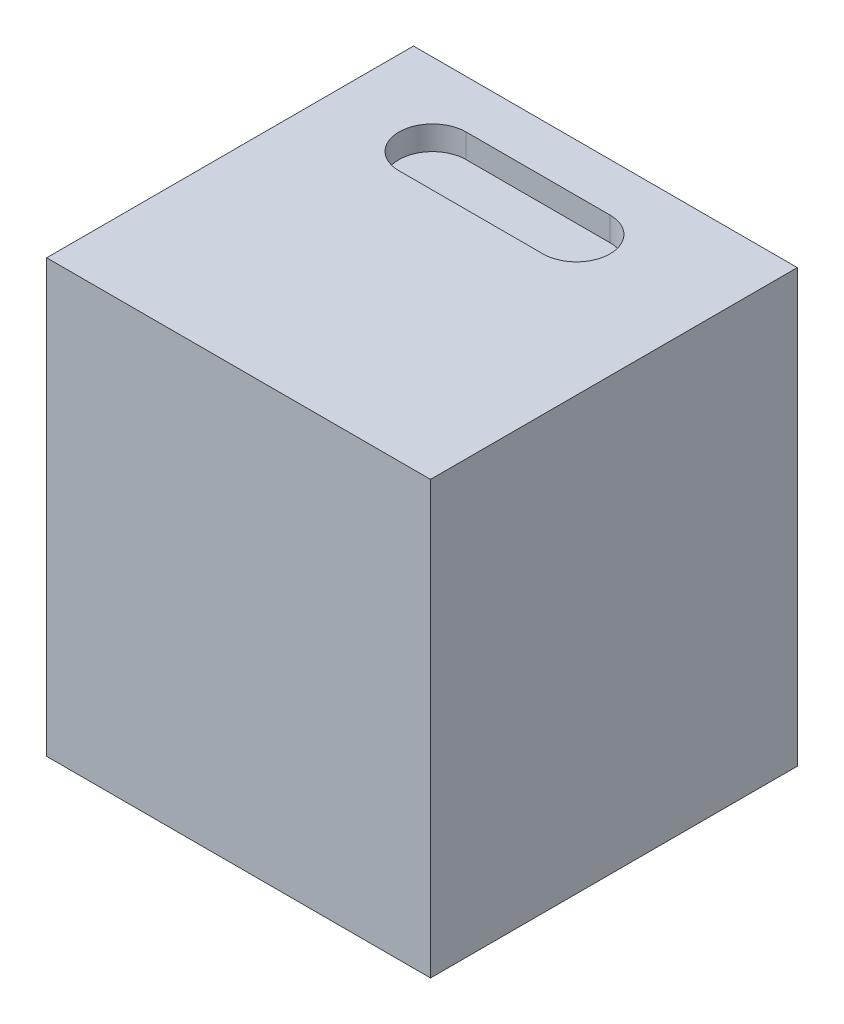
ISO-10303-21;
HEADER;
FILE_DESCRIPTION(('STEP AP214'),'2;1');
FILE_NAME('part.step','',(''),(''),'','','');
FILE_SCHEMA(('AUTOMOTIVE_DESIGN { 1 0 10303 214 1 1 1 1 }'));
ENDSEC;
DATA;
#1=APPLICATION_CONTEXT('core data for automotive mechanical design processes');
#2=APPLICATION_PROTOCOL_DEFINITION('international standard','automotive_design',2000,#1);
#3=PRODUCT_CONTEXT('',#1,'mechanical');
#4=PRODUCT('Part','Part','',(#3));
#5=PRODUCT_RELATED_PRODUCT_CATEGORY('part','',(#4));
#6=PRODUCT_DEFINITION_FORMATION('','',#4);
#7=PRODUCT_DEFINITION_CONTEXT('part definition',#1,'design');
#8=PRODUCT_DEFINITION('design','',#6,#7);
#9=PRODUCT_DEFINITION_SHAPE('','',#8);
#10=(LENGTH_UNIT() NAMED_UNIT(*) SI_UNIT(.MILLI.,.METRE.));
#11=(NAMED_UNIT(*) PLANE_ANGLE_UNIT() SI_UNIT($,.RADIAN.));
#12=(NAMED_UNIT(*) SI_UNIT($,.STERADIAN.) SOLID_ANGLE_UNIT());
#13=UNCERTAINTY_MEASURE_WITH_UNIT(LENGTH_MEASURE(1.E-05),#10,'distance_accuracy_value','');
#14=(GEOMETRIC_REPRESENTATION_CONTEXT(3) GLOBAL_UNCERTAINTY_ASSIGNED_CONTEXT((#13)) GLOBAL_UNIT_ASSIGNED_CONTEXT((#10,
#11,#12)) REPRESENTATION_CONTEXT('',''));
#15=CARTESIAN_POINT('',(0.,0.,0.));
#16=DIRECTION('',(0.,0.,1.));
#17=DIRECTION('',(1.,0.,0.));
#18=AXIS2_PLACEMENT_3D('',#15,#16,#17);
#19=CARTESIAN_POINT('',(-75.,20.,225.));
#20=DIRECTION('',(0.,-1.,0.));
#21=DIRECTION('',(0.,0.,-1.));
#22=AXIS2_PLACEMENT_3D('',#19,#20,#21);
#23=PLANE('',#22);
#24=CARTESIAN_POINT('',(-64.5,20.,183.));
#25=DIRECTION('',(0.,-1.,0.));
#26=DIRECTION('',(0.,0.,-1.));
#27=AXIS2_PLACEMENT_3D('',#24,#25,#26);
#28=CIRCLE('',#27,3.5);
#29=CARTESIAN_POINT('',(-64.5,20.,179.5));
#30=VERTEX_POINT('',#29);
#31=CARTESIAN_POINT('',(-64.5,20.,186.5));
#32=VERTEX_POINT('',#31);
#33=EDGE_CURVE('E321',#30,#32,#28,.F.);
#34=ORIENTED_EDGE('',*,*,#33,.F.);
#35=DIRECTION('',(-1.,0.,0.));
#36=VECTOR('',#35,1.);
#37=CARTESIAN_POINT('',(-74.9999999999999,20.,179.5));
#38=LINE('',#37,#36);
#39=CARTESIAN_POINT('',(-49.5,20.,179.5));
#40=VERTEX_POINT('',#39);
#41=EDGE_CURVE('E312',#40,#30,#38,.T.);
#42=ORIENTED_EDGE('',*,*,#41,.F.);
#43=CARTESIAN_POINT('',(-49.5,20.,183.));
#44=DIRECTION('',(0.,-1.,0.));
#45=DIRECTION('',(0.,0.,-1.));
#46=AXIS2_PLACEMENT_3D('',#43,#44,#45);
#47=CIRCLE('',#46,3.49999999999998);
#48=CARTESIAN_POINT('',(-49.5,20.,186.5));
#49=VERTEX_POINT('',#48);
#50=EDGE_CURVE('E315',#49,#40,#47,.F.);
#51=ORIENTED_EDGE('',*,*,#50,.F.);
#52=DIRECTION('',(1.,0.,0.));
#53=VECTOR('',#52,1.);
#54=CARTESIAN_POINT('',(-75.0000000000001,20.,186.5));
#55=LINE('',#54,#53);
#56=EDGE_CURVE('E318',#32,#49,#55,.T.);
#57=ORIENTED_EDGE('',*,*,#56,.F.);
#58=EDGE_LOOP('',(#34,#42,#51,#57));
#59=FACE_BOUND('',#58,.T.);
#60=DIRECTION('',(1.,0.,0.));
#61=VECTOR('',#60,1.);
#62=CARTESIAN_POINT('',(-75.,20.,174.484956087312));
#63=LINE('',#62,#61);
#64=CARTESIAN_POINT('',(-75.,20.,174.484956087312));
#65=VERTEX_POINT('',#64);
#66=CARTESIAN_POINT('',(-35.,20.,174.484956087312));
#67=VERTEX_POINT('',#66);
#68=EDGE_CURVE('E247',#65,#67,#63,.T.);
#69=ORIENTED_EDGE('',*,*,#68,.F.);
#70=DIRECTION('',(0.,0.,-1.));
#71=VECTOR('',#70,1.);
#72=CARTESIAN_POINT('',(-75.,20.,225.));
#73=LINE('',#72,#71);
#74=CARTESIAN_POINT('',(-75.,20.,212.710083215072));
#75=VERTEX_POINT('',#74);
#76=EDGE_CURVE('E324',#75,#65,#73,.T.);
#77=ORIENTED_EDGE('',*,*,#76,.F.);
#78=DIRECTION('',(-1.,0.,0.));
#79=VECTOR('',#78,1.);
#80=CARTESIAN_POINT('',(-75.,20.,212.710083215072));
#81=LINE('',#80,#79);
#82=CARTESIAN_POINT('',(-35.,20.,212.710083215072));
#83=VERTEX_POINT('',#82);
#84=EDGE_CURVE('E273',#83,#75,#81,.T.);
#85=ORIENTED_EDGE('',*,*,#84,.F.);
#86=DIRECTION('',(0.,0.,1.));
#87=VECTOR('',#86,1.);
#88=CARTESIAN_POINT('',(-35.,20.,225.));
#89=LINE('',#88,#87);
#90=EDGE_CURVE('E279',#67,#83,#89,.T.);
#91=ORIENTED_EDGE('',*,*,#90,.F.);
#92=EDGE_LOOP('',(#69,#77,#85,#91));
#93=FACE_BOUND('',#92,.T.);
#94=ADVANCED_FACE('F173',(#59,#93),#23,.F.);
#95=CARTESIAN_POINT('',(-75.,20.,225.));
#96=DIRECTION('',(1.,0.,0.));
#97=DIRECTION('',(0.,0.,-1.));
#98=AXIS2_PLACEMENT_3D('',#95,#96,#97);
#99=PLANE('',#98);
#100=CARTESIAN_POINT('',(-75.,-10.,195.));
#101=DIRECTION('',(-1.,0.,0.));
#102=DIRECTION('',(0.,0.,1.));
#103=AXIS2_PLACEMENT_3D('',#100,#101,#102);
#104=CIRCLE('',#103,11.);
#105=CARTESIAN_POINT('',(-75.,-10.,206.));
#106=VERTEX_POINT('',#105);
#107=EDGE_CURVE('E284',#106,#106,#104,.T.);
#108=ORIENTED_EDGE('',*,*,#107,.F.);
#109=EDGE_LOOP('',(#108));
#110=FACE_BOUND('',#109,.T.);
#111=DIRECTION('',(0.,1.,0.));
#112=VECTOR('',#111,1.);
#113=CARTESIAN_POINT('',(-75.,-25.,174.484956087312));
#114=LINE('',#113,#112);
#115=CARTESIAN_POINT('',(-75.,-25.,174.484956087312));
#116=VERTEX_POINT('',#115);
#117=EDGE_CURVE('E251',#116,#65,#114,.T.);
#118=ORIENTED_EDGE('',*,*,#117,.F.);
#119=DIRECTION('',(0.,0.,-1.));
#120=VECTOR('',#119,1.);
#121=CARTESIAN_POINT('',(-75.,-25.,225.));
#122=LINE('',#121,#120);
#123=CARTESIAN_POINT('',(-75.,-25.,212.710083215072));
#124=VERTEX_POINT('',#123);
#125=EDGE_CURVE('E265',#124,#116,#122,.T.);
#126=ORIENTED_EDGE('',*,*,#125,.F.);
#127=DIRECTION('',(0.,1.,0.));
#128=VECTOR('',#127,1.);
#129=CARTESIAN_POINT('',(-75.,-25.,212.710083215072));
#130=LINE('',#129,#128);
#131=EDGE_CURVE('E189',#124,#75,#130,.T.);
#132=ORIENTED_EDGE('',*,*,#131,.T.);
#133=ORIENTED_EDGE('',*,*,#76,.T.);
#134=EDGE_LOOP('',(#118,#126,#132,#133));
#135=FACE_BOUND('',#134,.T.);
#136=ADVANCED_FACE('F366',(#110,#135),#99,.F.);
#137=CARTESIAN_POINT('',(0.,-25.,0.));
#138=DIRECTION('',(0.,-1.,0.));
#139=DIRECTION('',(0.,0.,-1.));
#140=AXIS2_PLACEMENT_3D('',#137,#138,#139);
#141=PLANE('',#140);
#142=ORIENTED_EDGE('',*,*,#125,.T.);
#143=DIRECTION('',(-1.,0.,0.));
#144=VECTOR('',#143,1.);
#145=CARTESIAN_POINT('',(-75.,-25.,174.484956087312));
#146=LINE('',#145,#144);
#147=CARTESIAN_POINT('',(-35.,-25.,174.484956087312));
#148=VERTEX_POINT('',#147);
#149=EDGE_CURVE('E244',#148,#116,#146,.T.);
#150=ORIENTED_EDGE('',*,*,#149,.F.);
#151=DIRECTION('',(0.,0.,-1.));
#152=VECTOR('',#151,1.);
#153=CARTESIAN_POINT('',(-35.,-25.,174.484956087312));
#154=LINE('',#153,#152);
#155=CARTESIAN_POINT('',(-35.,-25.,212.710083215072));
#156=VERTEX_POINT('',#155);
#157=EDGE_CURVE('E255',#156,#148,#154,.T.);
#158=ORIENTED_EDGE('',*,*,#157,.F.);
#159=DIRECTION('',(1.,0.,0.));
#160=VECTOR('',#159,1.);
#161=CARTESIAN_POINT('',(-75.,-25.,212.710083215072));
#162=LINE('',#161,#160);
#163=EDGE_CURVE('E260',#124,#156,#162,.T.);
#164=ORIENTED_EDGE('',*,*,#163,.F.);
#165=EDGE_LOOP('',(#142,#150,#158,#164));
#166=FACE_BOUND('',#165,.T.);
#167=ADVANCED_FACE('F263',(#166),#141,.T.);
#168=CARTESIAN_POINT('',(-64.5,49.5,183.));
#169=DIRECTION('',(0.,-1.,0.));
#170=DIRECTION('',(0.,0.,-1.));
#171=AXIS2_PLACEMENT_3D('',#168,#169,#170);
#172=CYLINDRICAL_SURFACE('',#171,3.5);
#173=ORIENTED_EDGE('',*,*,#33,.T.);
#174=DIRECTION('',(0.,-1.,0.));
#175=VECTOR('',#174,1.);
#176=CARTESIAN_POINT('',(-64.5,49.5,186.5));
#177=LINE('',#176,#175);
#178=CARTESIAN_POINT('',(-64.5,17.5,186.5));
#179=VERTEX_POINT('',#178);
#180=EDGE_CURVE('E308',#32,#179,#177,.T.);
#181=ORIENTED_EDGE('',*,*,#180,.T.);
#182=CARTESIAN_POINT('',(-64.5,17.5,183.));
#183=DIRECTION('',(0.,1.,0.));
#184=DIRECTION('',(0.,0.,1.));
#185=AXIS2_PLACEMENT_3D('',#182,#183,#184);
#186=CIRCLE('',#185,3.5);
#187=CARTESIAN_POINT('',(-64.5,17.5,179.5));
#188=VERTEX_POINT('',#187);
#189=EDGE_CURVE('E12',#179,#188,#186,.F.);
#190=ORIENTED_EDGE('',*,*,#189,.T.);
#191=DIRECTION('',(0.,-1.,0.));
#192=VECTOR('',#191,1.);
#193=CARTESIAN_POINT('',(-64.5,49.5,179.5));
#194=LINE('',#193,#192);
#195=EDGE_CURVE('E298',#30,#188,#194,.T.);
#196=ORIENTED_EDGE('',*,*,#195,.F.);
#197=EDGE_LOOP('',(#173,#181,#190,#196));
#198=FACE_BOUND('',#197,.T.);
#199=ADVANCED_FACE('F345',(#198),#172,.F.);
#200=CARTESIAN_POINT('',(-64.5,49.5,186.5));
#201=DIRECTION('',(0.,0.,-1.));
#202=DIRECTION('',(-1.,0.,0.));
#203=AXIS2_PLACEMENT_3D('',#200,#201,#202);
#204=PLANE('',#203);
#205=ORIENTED_EDGE('',*,*,#56,.T.);
#206=DIRECTION('',(0.,-1.,0.));
#207=VECTOR('',#206,1.);
#208=CARTESIAN_POINT('',(-49.5,49.5,186.5));
#209=LINE('',#208,#207);
#210=CARTESIAN_POINT('',(-49.5,17.5,186.5));
#211=VERTEX_POINT('',#210);
#212=EDGE_CURVE('E304',#49,#211,#209,.T.);
#213=ORIENTED_EDGE('',*,*,#212,.T.);
#214=DIRECTION('',(-1.,0.,0.));
#215=VECTOR('',#214,1.);
#216=CARTESIAN_POINT('',(-70.,17.5,186.5));
#217=LINE('',#216,#215);
#218=EDGE_CURVE('E182',#211,#179,#217,.T.);
#219=ORIENTED_EDGE('',*,*,#218,.T.);
#220=ORIENTED_EDGE('',*,*,#180,.F.);
#221=EDGE_LOOP('',(#205,#213,#219,#220));
#222=FACE_BOUND('',#221,.T.);
#223=ADVANCED_FACE('F340',(#222),#204,.T.);
#224=CARTESIAN_POINT('',(-49.5,49.5,183.));
#225=DIRECTION('',(0.,-1.,0.));
#226=DIRECTION('',(0.,0.,-1.));
#227=AXIS2_PLACEMENT_3D('',#224,#225,#226);
#228=CYLINDRICAL_SURFACE('',#227,3.49999999999998);
#229=ORIENTED_EDGE('',*,*,#50,.T.);
#230=DIRECTION('',(0.,-1.,0.));
#231=VECTOR('',#230,1.);
#232=CARTESIAN_POINT('',(-49.5,49.5,179.5));
#233=LINE('',#232,#231);
#234=CARTESIAN_POINT('',(-49.5,17.5,179.5));
#235=VERTEX_POINT('',#234);
#236=EDGE_CURVE('E197',#40,#235,#233,.T.);
#237=ORIENTED_EDGE('',*,*,#236,.T.);
#238=CARTESIAN_POINT('',(-49.5,17.5,183.));
#239=DIRECTION('',(0.,1.,0.));
#240=DIRECTION('',(0.,0.,1.));
#241=AXIS2_PLACEMENT_3D('',#238,#239,#240);
#242=CIRCLE('',#241,3.49999999999998);
#243=EDGE_CURVE('E331',#235,#211,#242,.F.);
#244=ORIENTED_EDGE('',*,*,#243,.T.);
#245=ORIENTED_EDGE('',*,*,#212,.F.);
#246=EDGE_LOOP('',(#229,#237,#244,#245));
#247=FACE_BOUND('',#246,.T.);
#248=ADVANCED_FACE('F353',(#247),#228,.F.);
#249=CARTESIAN_POINT('',(-64.5,49.5,179.5));
#250=DIRECTION('',(0.,0.,1.));
#251=DIRECTION('',(1.,0.,0.));
#252=AXIS2_PLACEMENT_3D('',#249,#250,#251);
#253=PLANE('',#252);
#254=ORIENTED_EDGE('',*,*,#41,.T.);
#255=ORIENTED_EDGE('',*,*,#195,.T.);
#256=DIRECTION('',(1.,0.,0.));
#257=VECTOR('',#256,1.);
#258=CARTESIAN_POINT('',(-70.,17.5,179.5));
#259=LINE('',#258,#257);
#260=EDGE_CURVE('E328',#188,#235,#259,.T.);
#261=ORIENTED_EDGE('',*,*,#260,.T.);
#262=ORIENTED_EDGE('',*,*,#236,.F.);
#263=EDGE_LOOP('',(#254,#255,#261,#262));
#264=FACE_BOUND('',#263,.T.);
#265=ADVANCED_FACE('F355',(#264),#253,.T.);
#266=CARTESIAN_POINT('',(70.,17.5,225.));
#267=DIRECTION('',(0.,-1.,0.));
#268=DIRECTION('',(0.,0.,-1.));
#269=AXIS2_PLACEMENT_3D('',#266,#267,#268);
#270=PLANE('',#269);
#271=ORIENTED_EDGE('',*,*,#189,.F.);
#272=ORIENTED_EDGE('',*,*,#218,.F.);
#273=ORIENTED_EDGE('',*,*,#243,.F.);
#274=ORIENTED_EDGE('',*,*,#260,.F.);
#275=EDGE_LOOP('',(#271,#272,#273,#274));
#276=FACE_BOUND('',#275,.T.);
#277=ADVANCED_FACE('F354',(#276),#270,.F.);
#278=CARTESIAN_POINT('',(-68.,-10.,195.));
#279=DIRECTION('',(-1.,0.,0.));
#280=DIRECTION('',(0.,0.,1.));
#281=AXIS2_PLACEMENT_3D('',#278,#279,#280);
#282=PLANE('',#281);
#283=CARTESIAN_POINT('',(-68.,-10.,195.));
#284=DIRECTION('',(-1.,0.,0.));
#285=DIRECTION('',(0.,0.,1.));
#286=AXIS2_PLACEMENT_3D('',#283,#284,#285);
#287=CIRCLE('',#286,11.);
#288=CARTESIAN_POINT('',(-68.,-10.,206.));
#289=VERTEX_POINT('',#288);
#290=EDGE_CURVE('E285',#289,#289,#287,.T.);
#291=ORIENTED_EDGE('',*,*,#290,.T.);
#292=EDGE_LOOP('',(#291));
#293=FACE_BOUND('',#292,.T.);
#294=CARTESIAN_POINT('',(-68.,-10.,195.));
#295=DIRECTION('',(-1.,0.,0.));
#296=DIRECTION('',(0.,0.,1.));
#297=AXIS2_PLACEMENT_3D('',#294,#295,#296);
#298=CIRCLE('',#297,4.09999999999999);
#299=CARTESIAN_POINT('',(-68.,-10.,199.1));
#300=VERTEX_POINT('',#299);
#301=EDGE_CURVE('E176',#300,#300,#298,.F.);
#302=ORIENTED_EDGE('',*,*,#301,.T.);
#303=EDGE_LOOP('',(#302));
#304=FACE_BOUND('',#303,.T.);
#305=ADVANCED_FACE('F362',(#293,#304),#282,.T.);
#306=CARTESIAN_POINT('',(-68.,-10.,195.));
#307=DIRECTION('',(-1.,0.,0.));
#308=DIRECTION('',(0.,0.,1.));
#309=AXIS2_PLACEMENT_3D('',#306,#307,#308);
#310=CYLINDRICAL_SURFACE('',#309,11.);
#311=ORIENTED_EDGE('',*,*,#290,.F.);
#312=EDGE_LOOP('',(#311));
#313=FACE_BOUND('',#312,.T.);
#314=ORIENTED_EDGE('',*,*,#107,.T.);
#315=EDGE_LOOP('',(#314));
#316=FACE_BOUND('',#315,.T.);
#317=ADVANCED_FACE('F413',(#313,#316),#310,.F.);
#318=CARTESIAN_POINT('',(-53.,-10.,195.));
#319=DIRECTION('',(-1.,0.,0.));
#320=DIRECTION('',(0.,0.,1.));
#321=AXIS2_PLACEMENT_3D('',#318,#319,#320);
#322=PLANE('',#321);
#323=CARTESIAN_POINT('',(-53.,-10.,195.));
#324=DIRECTION('',(-1.,0.,0.));
#325=DIRECTION('',(0.,0.,1.));
#326=AXIS2_PLACEMENT_3D('',#323,#324,#325);
#327=CIRCLE('',#326,4.09999999999999);
#328=CARTESIAN_POINT('',(-53.,-10.,199.1));
#329=VERTEX_POINT('',#328);
#330=EDGE_CURVE('E292',#329,#329,#327,.T.);
#331=ORIENTED_EDGE('',*,*,#330,.T.);
#332=EDGE_LOOP('',(#331));
#333=FACE_BOUND('',#332,.T.);
#334=ADVANCED_FACE('F408',(#333),#322,.T.);
#335=CARTESIAN_POINT('',(-53.,-10.,195.));
#336=DIRECTION('',(-1.,0.,0.));
#337=DIRECTION('',(0.,0.,1.));
#338=AXIS2_PLACEMENT_3D('',#335,#336,#337);
#339=CYLINDRICAL_SURFACE('',#338,4.09999999999999);
#340=ORIENTED_EDGE('',*,*,#330,.F.);
#341=EDGE_LOOP('',(#340));
#342=FACE_BOUND('',#341,.T.);
#343=ORIENTED_EDGE('',*,*,#301,.F.);
#344=EDGE_LOOP('',(#343));
#345=FACE_BOUND('',#344,.T.);
#346=ADVANCED_FACE('F412',(#342,#345),#339,.F.);
#347=CARTESIAN_POINT('',(-75.,-25.,174.484956087312));
#348=DIRECTION('',(0.,0.,-1.));
#349=DIRECTION('',(-1.,0.,0.));
#350=AXIS2_PLACEMENT_3D('',#347,#348,#349);
#351=PLANE('',#350);
#352=ORIENTED_EDGE('',*,*,#68,.T.);
#353=DIRECTION('',(0.,1.,0.));
#354=VECTOR('',#353,1.);
#355=CARTESIAN_POINT('',(-35.,-25.,174.484956087312));
#356=LINE('',#355,#354);
#357=EDGE_CURVE('E240',#148,#67,#356,.T.);
#358=ORIENTED_EDGE('',*,*,#357,.F.);
#359=ORIENTED_EDGE('',*,*,#149,.T.);
#360=ORIENTED_EDGE('',*,*,#117,.T.);
#361=EDGE_LOOP('',(#352,#358,#359,#360));
#362=FACE_BOUND('',#361,.T.);
#363=ADVANCED_FACE('F242',(#362),#351,.T.);
#364=CARTESIAN_POINT('',(-35.,-25.,174.484956087312));
#365=DIRECTION('',(1.,0.,0.));
#366=DIRECTION('',(0.,0.,-1.));
#367=AXIS2_PLACEMENT_3D('',#364,#365,#366);
#368=PLANE('',#367);
#369=ORIENTED_EDGE('',*,*,#90,.T.);
#370=DIRECTION('',(0.,1.,0.));
#371=VECTOR('',#370,1.);
#372=CARTESIAN_POINT('',(-35.,-25.,212.710083215072));
#373=LINE('',#372,#371);
#374=EDGE_CURVE('E252',#156,#83,#373,.T.);
#375=ORIENTED_EDGE('',*,*,#374,.F.);
#376=ORIENTED_EDGE('',*,*,#157,.T.);
#377=ORIENTED_EDGE('',*,*,#357,.T.);
#378=EDGE_LOOP('',(#369,#375,#376,#377));
#379=FACE_BOUND('',#378,.T.);
#380=ADVANCED_FACE('F256',(#379),#368,.T.);
#381=CARTESIAN_POINT('',(-75.,-25.,212.710083215072));
#382=DIRECTION('',(0.,0.,1.));
#383=DIRECTION('',(1.,0.,0.));
#384=AXIS2_PLACEMENT_3D('',#381,#382,#383);
#385=PLANE('',#384);
#386=ORIENTED_EDGE('',*,*,#84,.T.);
#387=ORIENTED_EDGE('',*,*,#131,.F.);
#388=ORIENTED_EDGE('',*,*,#163,.T.);
#389=ORIENTED_EDGE('',*,*,#374,.T.);
#390=EDGE_LOOP('',(#386,#387,#388,#389));
#391=FACE_BOUND('',#390,.T.);
#392=ADVANCED_FACE('F481',(#391),#385,.T.);
#393=CLOSED_SHELL('',(#94,#136,#167,#199,#223,#248,#265,#277,#305,#317,#334,#346,#363,#380,#392));
#394=MANIFOLD_SOLID_BREP('B2',#393);
#395=ADVANCED_BREP_SHAPE_REPRESENTATION('',(#18,#394),#14);
#396=SHAPE_DEFINITION_REPRESENTATION(#9,#395);
ENDSEC;
END-ISO-10303-21;
